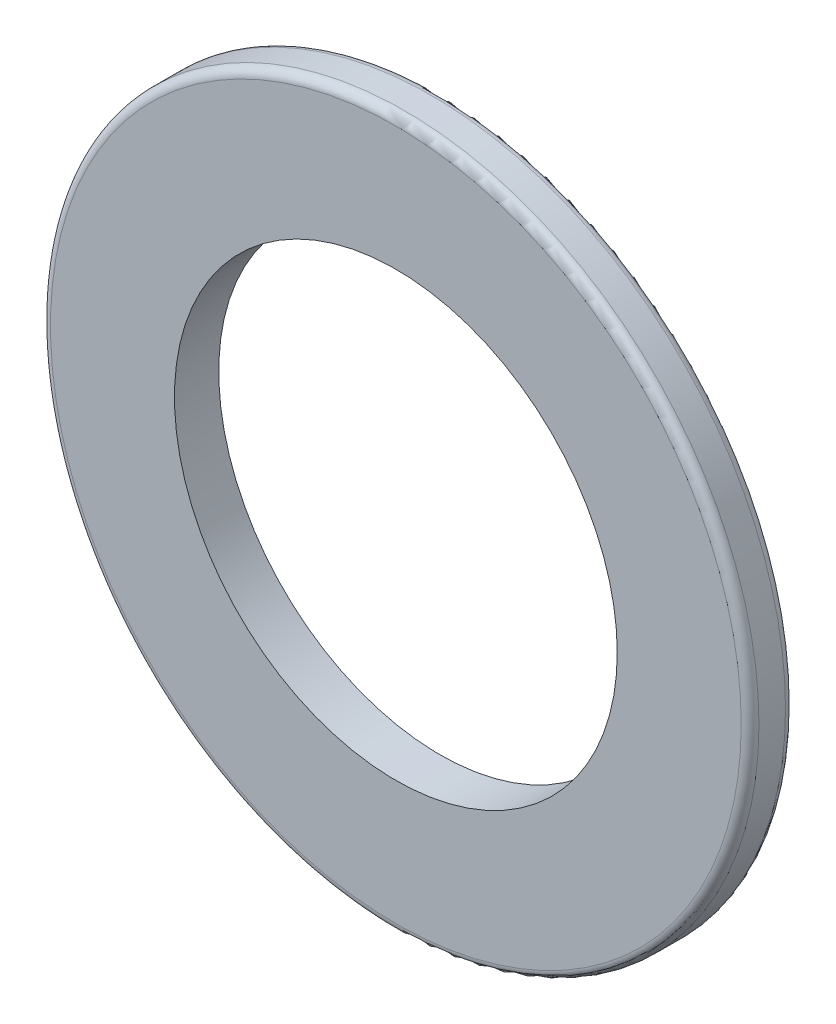
ISO-10303-21;
HEADER;
FILE_DESCRIPTION(('STEP AP214'),'2;1');
FILE_NAME('part.step','',(''),(''),'','','');
FILE_SCHEMA(('AUTOMOTIVE_DESIGN { 1 0 10303 214 1 1 1 1 }'));
ENDSEC;
DATA;
#1=APPLICATION_CONTEXT('core data for automotive mechanical design processes');
#2=APPLICATION_PROTOCOL_DEFINITION('international standard','automotive_design',2000,#1);
#3=PRODUCT_CONTEXT('',#1,'mechanical');
#4=PRODUCT('Part','Part','',(#3));
#5=PRODUCT_RELATED_PRODUCT_CATEGORY('part','',(#4));
#6=PRODUCT_DEFINITION_FORMATION('','',#4);
#7=PRODUCT_DEFINITION_CONTEXT('part definition',#1,'design');
#8=PRODUCT_DEFINITION('design','',#6,#7);
#9=PRODUCT_DEFINITION_SHAPE('','',#8);
#10=(LENGTH_UNIT() NAMED_UNIT(*) SI_UNIT(.MILLI.,.METRE.));
#11=(NAMED_UNIT(*) PLANE_ANGLE_UNIT() SI_UNIT($,.RADIAN.));
#12=(NAMED_UNIT(*) SI_UNIT($,.STERADIAN.) SOLID_ANGLE_UNIT());
#13=UNCERTAINTY_MEASURE_WITH_UNIT(LENGTH_MEASURE(1.E-05),#10,'distance_accuracy_value','');
#14=(GEOMETRIC_REPRESENTATION_CONTEXT(3) GLOBAL_UNCERTAINTY_ASSIGNED_CONTEXT((#13)) GLOBAL_UNIT_ASSIGNED_CONTEXT((#10,
#11,#12)) REPRESENTATION_CONTEXT('',''));
#15=CARTESIAN_POINT('',(0.,0.,0.));
#16=DIRECTION('',(0.,0.,1.));
#17=DIRECTION('',(1.,0.,0.));
#18=AXIS2_PLACEMENT_3D('',#15,#16,#17);
#19=CARTESIAN_POINT('',(0.,0.,0.5));
#20=DIRECTION('',(0.,0.,1.));
#21=DIRECTION('',(1.,0.,0.));
#22=AXIS2_PLACEMENT_3D('',#19,#20,#21);
#23=PLANE('',#22);
#24=CARTESIAN_POINT('',(0.,0.,0.5));
#25=DIRECTION('',(0.,0.,1.));
#26=DIRECTION('',(1.,0.,0.));
#27=AXIS2_PLACEMENT_3D('',#24,#25,#26);
#28=CIRCLE('',#27,3.9);
#29=CARTESIAN_POINT('',(3.9,0.,0.5));
#30=VERTEX_POINT('',#29);
#31=EDGE_CURVE('E10',#30,#30,#28,.T.);
#32=ORIENTED_EDGE('',*,*,#31,.T.);
#33=EDGE_LOOP('',(#32));
#34=FACE_BOUND('',#33,.T.);
#35=CARTESIAN_POINT('',(0.,0.,0.5));
#36=DIRECTION('',(0.,0.,1.));
#37=DIRECTION('',(1.,0.,0.));
#38=AXIS2_PLACEMENT_3D('',#35,#36,#37);
#39=CIRCLE('',#38,2.5);
#40=CARTESIAN_POINT('',(2.5,0.,0.5));
#41=VERTEX_POINT('',#40);
#42=EDGE_CURVE('E57',#41,#41,#39,.T.);
#43=ORIENTED_EDGE('',*,*,#42,.F.);
#44=EDGE_LOOP('',(#43));
#45=FACE_BOUND('',#44,.T.);
#46=ADVANCED_FACE('F37',(#34,#45),#23,.T.);
#47=CARTESIAN_POINT('',(0.,0.,0.));
#48=DIRECTION('',(0.,0.,1.));
#49=DIRECTION('',(1.,0.,0.));
#50=AXIS2_PLACEMENT_3D('',#47,#48,#49);
#51=PLANE('',#50);
#52=CARTESIAN_POINT('',(0.,0.,0.));
#53=DIRECTION('',(0.,0.,1.));
#54=DIRECTION('',(1.,0.,0.));
#55=AXIS2_PLACEMENT_3D('',#52,#53,#54);
#56=CIRCLE('',#55,3.9);
#57=CARTESIAN_POINT('',(3.9,0.,0.));
#58=VERTEX_POINT('',#57);
#59=EDGE_CURVE('E44',#58,#58,#56,.F.);
#60=ORIENTED_EDGE('',*,*,#59,.T.);
#61=EDGE_LOOP('',(#60));
#62=FACE_BOUND('',#61,.T.);
#63=CARTESIAN_POINT('',(0.,0.,0.));
#64=DIRECTION('',(0.,0.,1.));
#65=DIRECTION('',(1.,0.,0.));
#66=AXIS2_PLACEMENT_3D('',#63,#64,#65);
#67=CIRCLE('',#66,2.5);
#68=CARTESIAN_POINT('',(2.5,0.,0.));
#69=VERTEX_POINT('',#68);
#70=EDGE_CURVE('E58',#69,#69,#67,.T.);
#71=ORIENTED_EDGE('',*,*,#70,.T.);
#72=EDGE_LOOP('',(#71));
#73=FACE_BOUND('',#72,.T.);
#74=ADVANCED_FACE('F68',(#62,#73),#51,.F.);
#75=CARTESIAN_POINT('',(0.,0.,0.5));
#76=DIRECTION('',(0.,0.,-1.));
#77=DIRECTION('',(-1.,0.,0.));
#78=AXIS2_PLACEMENT_3D('',#75,#76,#77);
#79=CYLINDRICAL_SURFACE('',#78,4.);
#80=CARTESIAN_POINT('',(0.,0.,0.1));
#81=DIRECTION('',(0.,0.,1.));
#82=DIRECTION('',(1.,0.,0.));
#83=AXIS2_PLACEMENT_3D('',#80,#81,#82);
#84=CIRCLE('',#83,4.);
#85=CARTESIAN_POINT('',(4.,0.,0.1));
#86=VERTEX_POINT('',#85);
#87=EDGE_CURVE('E48',#86,#86,#84,.T.);
#88=ORIENTED_EDGE('',*,*,#87,.T.);
#89=EDGE_LOOP('',(#88));
#90=FACE_BOUND('',#89,.T.);
#91=CARTESIAN_POINT('',(0.,0.,0.4));
#92=DIRECTION('',(0.,0.,1.));
#93=DIRECTION('',(1.,0.,0.));
#94=AXIS2_PLACEMENT_3D('',#91,#92,#93);
#95=CIRCLE('',#94,4.);
#96=CARTESIAN_POINT('',(4.,0.,0.4));
#97=VERTEX_POINT('',#96);
#98=EDGE_CURVE('E52',#97,#97,#95,.F.);
#99=ORIENTED_EDGE('',*,*,#98,.T.);
#100=EDGE_LOOP('',(#99));
#101=FACE_BOUND('',#100,.T.);
#102=ADVANCED_FACE('F74',(#90,#101),#79,.T.);
#103=CARTESIAN_POINT('',(0.,0.,0.5));
#104=DIRECTION('',(0.,0.,-1.));
#105=DIRECTION('',(-1.,0.,0.));
#106=AXIS2_PLACEMENT_3D('',#103,#104,#105);
#107=CYLINDRICAL_SURFACE('',#106,2.5);
#108=ORIENTED_EDGE('',*,*,#42,.T.);
#109=EDGE_LOOP('',(#108));
#110=FACE_BOUND('',#109,.T.);
#111=ORIENTED_EDGE('',*,*,#70,.F.);
#112=EDGE_LOOP('',(#111));
#113=FACE_BOUND('',#112,.T.);
#114=ADVANCED_FACE('F64',(#110,#113),#107,.F.);
#115=CARTESIAN_POINT('',(0.,0.,0.1));
#116=DIRECTION('',(0.,0.,1.));
#117=DIRECTION('',(1.,0.,0.));
#118=AXIS2_PLACEMENT_3D('',#115,#116,#117);
#119=TOROIDAL_SURFACE('',#118,3.9,0.1);
#120=ORIENTED_EDGE('',*,*,#59,.F.);
#121=EDGE_LOOP('',(#120));
#122=FACE_BOUND('',#121,.T.);
#123=ORIENTED_EDGE('',*,*,#87,.F.);
#124=EDGE_LOOP('',(#123));
#125=FACE_BOUND('',#124,.T.);
#126=ADVANCED_FACE('F80',(#122,#125),#119,.T.);
#127=CARTESIAN_POINT('',(0.,0.,0.4));
#128=DIRECTION('',(0.,0.,1.));
#129=DIRECTION('',(1.,0.,0.));
#130=AXIS2_PLACEMENT_3D('',#127,#128,#129);
#131=TOROIDAL_SURFACE('',#130,3.9,0.1);
#132=ORIENTED_EDGE('',*,*,#98,.F.);
#133=EDGE_LOOP('',(#132));
#134=FACE_BOUND('',#133,.T.);
#135=ORIENTED_EDGE('',*,*,#31,.F.);
#136=EDGE_LOOP('',(#135));
#137=FACE_BOUND('',#136,.T.);
#138=ADVANCED_FACE('F39',(#134,#137),#131,.T.);
#139=CLOSED_SHELL('',(#46,#74,#102,#114,#126,#138));
#140=MANIFOLD_SOLID_BREP('B2',#139);
#141=ADVANCED_BREP_SHAPE_REPRESENTATION('',(#18,#140),#14);
#142=SHAPE_DEFINITION_REPRESENTATION(#9,#141);
ENDSEC;
END-ISO-10303-21;
